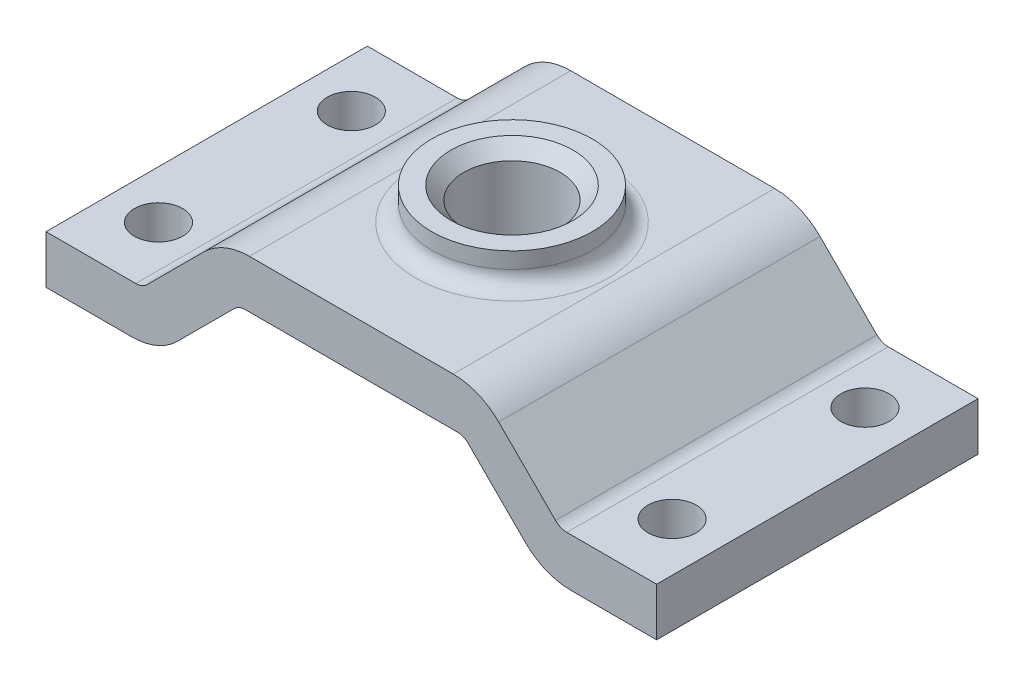
ISO-10303-21;
HEADER;
FILE_DESCRIPTION(('STEP AP214'),'2;1');
FILE_NAME('part.step','',(''),(''),'','','');
FILE_SCHEMA(('AUTOMOTIVE_DESIGN { 1 0 10303 214 1 1 1 1 }'));
ENDSEC;
DATA;
#1=APPLICATION_CONTEXT('core data for automotive mechanical design processes');
#2=APPLICATION_PROTOCOL_DEFINITION('international standard','automotive_design',2000,#1);
#3=PRODUCT_CONTEXT('',#1,'mechanical');
#4=PRODUCT('Part','Part','',(#3));
#5=PRODUCT_RELATED_PRODUCT_CATEGORY('part','',(#4));
#6=PRODUCT_DEFINITION_FORMATION('','',#4);
#7=PRODUCT_DEFINITION_CONTEXT('part definition',#1,'design');
#8=PRODUCT_DEFINITION('design','',#6,#7);
#9=PRODUCT_DEFINITION_SHAPE('','',#8);
#10=(LENGTH_UNIT() NAMED_UNIT(*) SI_UNIT(.MILLI.,.METRE.));
#11=(NAMED_UNIT(*) PLANE_ANGLE_UNIT() SI_UNIT($,.RADIAN.));
#12=(NAMED_UNIT(*) SI_UNIT($,.STERADIAN.) SOLID_ANGLE_UNIT());
#13=UNCERTAINTY_MEASURE_WITH_UNIT(LENGTH_MEASURE(1.E-05),#10,'distance_accuracy_value','');
#14=(GEOMETRIC_REPRESENTATION_CONTEXT(3) GLOBAL_UNCERTAINTY_ASSIGNED_CONTEXT((#13)) GLOBAL_UNIT_ASSIGNED_CONTEXT((#10,
#11,#12)) REPRESENTATION_CONTEXT('',''));
#15=CARTESIAN_POINT('',(0.,0.,0.));
#16=DIRECTION('',(0.,0.,1.));
#17=DIRECTION('',(1.,0.,0.));
#18=AXIS2_PLACEMENT_3D('',#15,#16,#17);
#19=CARTESIAN_POINT('',(-12.7,12.7,31.75));
#20=DIRECTION('',(0.707106781186548,-0.707106781186547,0.));
#21=DIRECTION('',(0.707106781186547,0.707106781186548,0.));
#22=AXIS2_PLACEMENT_3D('',#19,#20,#21);
#23=PLANE('',#22);
#24=DIRECTION('',(-0.707106781186547,-0.707106781186548,0.));
#25=VECTOR('',#24,1.);
#26=CARTESIAN_POINT('',(-12.7,12.7,-31.75));
#27=LINE('',#26,#25);
#28=CARTESIAN_POINT('',(-29.1197438789309,-3.71974387893088,-31.75));
#29=VERTEX_POINT('',#28);
#30=CARTESIAN_POINT('',(-40.3450640302673,-14.9450640302673,-31.75));
#31=VERTEX_POINT('',#30);
#32=EDGE_CURVE('E222',#29,#31,#27,.T.);
#33=ORIENTED_EDGE('',*,*,#32,.T.);
#34=DIRECTION('',(0.,0.,-1.));
#35=VECTOR('',#34,1.);
#36=CARTESIAN_POINT('',(-40.3450640302673,-14.9450640302673,31.75));
#37=LINE('',#36,#35);
#38=CARTESIAN_POINT('',(-40.3450640302673,-14.9450640302673,31.75));
#39=VERTEX_POINT('',#38);
#40=EDGE_CURVE('E351',#39,#31,#37,.T.);
#41=ORIENTED_EDGE('',*,*,#40,.F.);
#42=DIRECTION('',(-0.707106781186547,-0.707106781186548,0.));
#43=VECTOR('',#42,1.);
#44=CARTESIAN_POINT('',(-12.7,12.7,31.75));
#45=LINE('',#44,#43);
#46=CARTESIAN_POINT('',(-29.1197438789309,-3.71974387893088,31.75));
#47=VERTEX_POINT('',#46);
#48=EDGE_CURVE('E294',#47,#39,#45,.T.);
#49=ORIENTED_EDGE('',*,*,#48,.F.);
#50=DIRECTION('',(0.,0.,-1.));
#51=VECTOR('',#50,1.);
#52=CARTESIAN_POINT('',(-29.1197438789309,-3.71974387893088,31.75));
#53=LINE('',#52,#51);
#54=EDGE_CURVE('E64',#47,#29,#53,.T.);
#55=ORIENTED_EDGE('',*,*,#54,.T.);
#56=EDGE_LOOP('',(#33,#41,#49,#55));
#57=FACE_BOUND('',#56,.T.);
#58=ADVANCED_FACE('F45',(#57),#23,.F.);
#59=CARTESIAN_POINT('',(-42.5901280605346,-12.7,31.75));
#60=DIRECTION('',(0.,0.,-1.));
#61=DIRECTION('',(-1.,0.,0.));
#62=AXIS2_PLACEMENT_3D('',#59,#60,#61);
#63=CYLINDRICAL_SURFACE('',#62,3.175);
#64=CARTESIAN_POINT('',(-42.5901280605346,-12.7,-31.75));
#65=DIRECTION('',(0.,0.,1.));
#66=DIRECTION('',(1.,0.,0.));
#67=AXIS2_PLACEMENT_3D('',#64,#65,#66);
#68=CIRCLE('',#67,3.175);
#69=CARTESIAN_POINT('',(-42.5901280605346,-15.875,-31.75));
#70=VERTEX_POINT('',#69);
#71=EDGE_CURVE('E225',#31,#70,#68,.F.);
#72=ORIENTED_EDGE('',*,*,#71,.T.);
#73=DIRECTION('',(0.,0.,-1.));
#74=VECTOR('',#73,1.);
#75=CARTESIAN_POINT('',(-42.5901280605346,-15.875,31.75));
#76=LINE('',#75,#74);
#77=CARTESIAN_POINT('',(-42.5901280605346,-15.875,31.75));
#78=VERTEX_POINT('',#77);
#79=EDGE_CURVE('E347',#78,#70,#76,.T.);
#80=ORIENTED_EDGE('',*,*,#79,.F.);
#81=CARTESIAN_POINT('',(-42.5901280605346,-12.7,31.75));
#82=DIRECTION('',(0.,0.,1.));
#83=DIRECTION('',(1.,0.,0.));
#84=AXIS2_PLACEMENT_3D('',#81,#82,#83);
#85=CIRCLE('',#84,3.175);
#86=EDGE_CURVE('E139',#39,#78,#85,.F.);
#87=ORIENTED_EDGE('',*,*,#86,.F.);
#88=ORIENTED_EDGE('',*,*,#40,.T.);
#89=EDGE_LOOP('',(#72,#80,#87,#88));
#90=FACE_BOUND('',#89,.T.);
#91=ADVANCED_FACE('F391',(#90),#63,.F.);
#92=CARTESIAN_POINT('',(0.,-15.875,31.75));
#93=DIRECTION('',(0.,-1.,0.));
#94=DIRECTION('',(1.,0.,0.));
#95=AXIS2_PLACEMENT_3D('',#92,#93,#94);
#96=PLANE('',#95);
#97=CARTESIAN_POINT('',(-50.8,-15.875,19.05));
#98=DIRECTION('',(0.,1.,0.));
#99=DIRECTION('',(-1.,0.,0.));
#100=AXIS2_PLACEMENT_3D('',#97,#98,#99);
#101=CIRCLE('',#100,4.7625);
#102=CARTESIAN_POINT('',(-55.5625,-15.875,19.05));
#103=VERTEX_POINT('',#102);
#104=EDGE_CURVE('E562',#103,#103,#101,.T.);
#105=ORIENTED_EDGE('',*,*,#104,.F.);
#106=EDGE_LOOP('',(#105));
#107=FACE_BOUND('',#106,.T.);
#108=CARTESIAN_POINT('',(-50.8,-15.875,-19.05));
#109=DIRECTION('',(0.,1.,0.));
#110=DIRECTION('',(-1.,0.,0.));
#111=AXIS2_PLACEMENT_3D('',#108,#109,#110);
#112=CIRCLE('',#111,4.7625);
#113=CARTESIAN_POINT('',(-55.5625,-15.875,-19.05));
#114=VERTEX_POINT('',#113);
#115=EDGE_CURVE('E566',#114,#114,#112,.T.);
#116=ORIENTED_EDGE('',*,*,#115,.F.);
#117=EDGE_LOOP('',(#116));
#118=FACE_BOUND('',#117,.T.);
#119=DIRECTION('',(-1.,0.,0.));
#120=VECTOR('',#119,1.);
#121=CARTESIAN_POINT('',(0.,-15.875,-31.75));
#122=LINE('',#121,#120);
#123=CARTESIAN_POINT('',(-60.325,-15.875,-31.75));
#124=VERTEX_POINT('',#123);
#125=EDGE_CURVE('E229',#70,#124,#122,.T.);
#126=ORIENTED_EDGE('',*,*,#125,.T.);
#127=DIRECTION('',(0.,0.,-1.));
#128=VECTOR('',#127,1.);
#129=CARTESIAN_POINT('',(-60.325,-15.875,31.75));
#130=LINE('',#129,#128);
#131=CARTESIAN_POINT('',(-60.325,-15.875,31.75));
#132=VERTEX_POINT('',#131);
#133=EDGE_CURVE('E343',#132,#124,#130,.T.);
#134=ORIENTED_EDGE('',*,*,#133,.F.);
#135=DIRECTION('',(-1.,0.,0.));
#136=VECTOR('',#135,1.);
#137=CARTESIAN_POINT('',(0.,-15.875,31.75));
#138=LINE('',#137,#136);
#139=EDGE_CURVE('E432',#78,#132,#138,.T.);
#140=ORIENTED_EDGE('',*,*,#139,.F.);
#141=ORIENTED_EDGE('',*,*,#79,.T.);
#142=EDGE_LOOP('',(#126,#134,#140,#141));
#143=FACE_BOUND('',#142,.T.);
#144=ADVANCED_FACE('F396',(#107,#118,#143),#96,.F.);
#145=CARTESIAN_POINT('',(-60.325,0.,31.75));
#146=DIRECTION('',(1.,0.,0.));
#147=DIRECTION('',(0.,0.,-1.));
#148=AXIS2_PLACEMENT_3D('',#145,#146,#147);
#149=PLANE('',#148);
#150=DIRECTION('',(0.,-1.,0.));
#151=VECTOR('',#150,1.);
#152=CARTESIAN_POINT('',(-60.325,0.,-31.75));
#153=LINE('',#152,#151);
#154=CARTESIAN_POINT('',(-60.325,-25.4,-31.75));
#155=VERTEX_POINT('',#154);
#156=EDGE_CURVE('E232',#124,#155,#153,.T.);
#157=ORIENTED_EDGE('',*,*,#156,.T.);
#158=DIRECTION('',(0.,0.,-1.));
#159=VECTOR('',#158,1.);
#160=CARTESIAN_POINT('',(-60.325,-25.4,31.75));
#161=LINE('',#160,#159);
#162=CARTESIAN_POINT('',(-60.325,-25.4,31.75));
#163=VERTEX_POINT('',#162);
#164=EDGE_CURVE('E339',#163,#155,#161,.T.);
#165=ORIENTED_EDGE('',*,*,#164,.F.);
#166=DIRECTION('',(0.,-1.,0.));
#167=VECTOR('',#166,1.);
#168=CARTESIAN_POINT('',(-60.325,0.,31.75));
#169=LINE('',#168,#167);
#170=EDGE_CURVE('E435',#132,#163,#169,.T.);
#171=ORIENTED_EDGE('',*,*,#170,.F.);
#172=ORIENTED_EDGE('',*,*,#133,.T.);
#173=EDGE_LOOP('',(#157,#165,#171,#172));
#174=FACE_BOUND('',#173,.T.);
#175=ADVANCED_FACE('F551',(#174),#149,.F.);
#176=CARTESIAN_POINT('',(0.,-25.4,31.75));
#177=DIRECTION('',(0.,1.,0.));
#178=DIRECTION('',(0.,0.,1.));
#179=AXIS2_PLACEMENT_3D('',#176,#177,#178);
#180=PLANE('',#179);
#181=CARTESIAN_POINT('',(-50.8,-25.4,19.05));
#182=DIRECTION('',(0.,1.,0.));
#183=DIRECTION('',(-1.,0.,0.));
#184=AXIS2_PLACEMENT_3D('',#181,#182,#183);
#185=CIRCLE('',#184,4.7625);
#186=CARTESIAN_POINT('',(-55.5625,-25.4,19.05));
#187=VERTEX_POINT('',#186);
#188=EDGE_CURVE('E612',#187,#187,#185,.T.);
#189=ORIENTED_EDGE('',*,*,#188,.T.);
#190=EDGE_LOOP('',(#189));
#191=FACE_BOUND('',#190,.T.);
#192=CARTESIAN_POINT('',(-50.8,-25.4,-19.05));
#193=DIRECTION('',(0.,1.,0.));
#194=DIRECTION('',(-1.,0.,0.));
#195=AXIS2_PLACEMENT_3D('',#192,#193,#194);
#196=CIRCLE('',#195,4.7625);
#197=CARTESIAN_POINT('',(-55.5625,-25.4,-19.05));
#198=VERTEX_POINT('',#197);
#199=EDGE_CURVE('E606',#198,#198,#196,.T.);
#200=ORIENTED_EDGE('',*,*,#199,.T.);
#201=EDGE_LOOP('',(#200));
#202=FACE_BOUND('',#201,.T.);
#203=DIRECTION('',(1.,0.,0.));
#204=VECTOR('',#203,1.);
#205=CARTESIAN_POINT('',(0.,-25.4,-31.75));
#206=LINE('',#205,#204);
#207=CARTESIAN_POINT('',(-43.3605122421384,-25.4,-31.75));
#208=VERTEX_POINT('',#207);
#209=EDGE_CURVE('E235',#155,#208,#206,.T.);
#210=ORIENTED_EDGE('',*,*,#209,.T.);
#211=DIRECTION('',(0.,0.,-1.));
#212=VECTOR('',#211,1.);
#213=CARTESIAN_POINT('',(-43.3605122421384,-25.4,31.75));
#214=LINE('',#213,#212);
#215=CARTESIAN_POINT('',(-43.3605122421384,-25.4,31.75));
#216=VERTEX_POINT('',#215);
#217=EDGE_CURVE('E335',#216,#208,#214,.T.);
#218=ORIENTED_EDGE('',*,*,#217,.F.);
#219=DIRECTION('',(1.,0.,0.));
#220=VECTOR('',#219,1.);
#221=CARTESIAN_POINT('',(0.,-25.4,31.75));
#222=LINE('',#221,#220);
#223=EDGE_CURVE('E438',#163,#216,#222,.T.);
#224=ORIENTED_EDGE('',*,*,#223,.F.);
#225=ORIENTED_EDGE('',*,*,#164,.T.);
#226=EDGE_LOOP('',(#210,#218,#224,#225));
#227=FACE_BOUND('',#226,.T.);
#228=ADVANCED_FACE('F547',(#191,#202,#227),#180,.F.);
#229=CARTESIAN_POINT('',(-43.3605122421383,-12.7,31.75));
#230=DIRECTION('',(0.,0.,-1.));
#231=DIRECTION('',(-1.,0.,0.));
#232=AXIS2_PLACEMENT_3D('',#229,#230,#231);
#233=CYLINDRICAL_SURFACE('',#232,12.7);
#234=CARTESIAN_POINT('',(-43.3605122421383,-12.7,-31.75));
#235=DIRECTION('',(0.,0.,1.));
#236=DIRECTION('',(1.,0.,0.));
#237=AXIS2_PLACEMENT_3D('',#234,#235,#236);
#238=CIRCLE('',#237,12.7);
#239=CARTESIAN_POINT('',(-34.3802561210691,-21.6802561210691,-31.75));
#240=VERTEX_POINT('',#239);
#241=EDGE_CURVE('E238',#208,#240,#238,.T.);
#242=ORIENTED_EDGE('',*,*,#241,.T.);
#243=DIRECTION('',(0.,0.,-1.));
#244=VECTOR('',#243,1.);
#245=CARTESIAN_POINT('',(-34.3802561210691,-21.6802561210691,31.75));
#246=LINE('',#245,#244);
#247=CARTESIAN_POINT('',(-34.3802561210691,-21.6802561210691,31.75));
#248=VERTEX_POINT('',#247);
#249=EDGE_CURVE('E331',#248,#240,#246,.T.);
#250=ORIENTED_EDGE('',*,*,#249,.F.);
#251=CARTESIAN_POINT('',(-43.3605122421383,-12.7,31.75));
#252=DIRECTION('',(0.,0.,1.));
#253=DIRECTION('',(1.,0.,0.));
#254=AXIS2_PLACEMENT_3D('',#251,#252,#253);
#255=CIRCLE('',#254,12.7);
#256=EDGE_CURVE('E441',#216,#248,#255,.T.);
#257=ORIENTED_EDGE('',*,*,#256,.F.);
#258=ORIENTED_EDGE('',*,*,#217,.T.);
#259=EDGE_LOOP('',(#242,#250,#257,#258));
#260=FACE_BOUND('',#259,.T.);
#261=ADVANCED_FACE('F543',(#260),#233,.T.);
#262=CARTESIAN_POINT('',(-6.34999999999998,6.34999999999999,31.75));
#263=DIRECTION('',(-0.707106781186547,0.707106781186548,0.));
#264=DIRECTION('',(-0.707106781186548,-0.707106781186547,0.));
#265=AXIS2_PLACEMENT_3D('',#262,#263,#264);
#266=PLANE('',#265);
#267=DIRECTION('',(0.707106781186548,0.707106781186547,0.));
#268=VECTOR('',#267,1.);
#269=CARTESIAN_POINT('',(-6.34999999999998,6.34999999999999,-31.75));
#270=LINE('',#269,#268);
#271=CARTESIAN_POINT('',(-23.1549359697327,-10.4549359697327,-31.75));
#272=VERTEX_POINT('',#271);
#273=EDGE_CURVE('E241',#240,#272,#270,.T.);
#274=ORIENTED_EDGE('',*,*,#273,.T.);
#275=DIRECTION('',(0.,0.,-1.));
#276=VECTOR('',#275,1.);
#277=CARTESIAN_POINT('',(-23.1549359697327,-10.4549359697327,31.75));
#278=LINE('',#277,#276);
#279=CARTESIAN_POINT('',(-23.1549359697327,-10.4549359697327,31.75));
#280=VERTEX_POINT('',#279);
#281=EDGE_CURVE('E328',#280,#272,#278,.T.);
#282=ORIENTED_EDGE('',*,*,#281,.F.);
#283=DIRECTION('',(0.707106781186548,0.707106781186547,0.));
#284=VECTOR('',#283,1.);
#285=CARTESIAN_POINT('',(-6.34999999999998,6.34999999999999,31.75));
#286=LINE('',#285,#284);
#287=EDGE_CURVE('E444',#248,#280,#286,.T.);
#288=ORIENTED_EDGE('',*,*,#287,.F.);
#289=ORIENTED_EDGE('',*,*,#249,.T.);
#290=EDGE_LOOP('',(#274,#282,#288,#289));
#291=FACE_BOUND('',#290,.T.);
#292=ADVANCED_FACE('F539',(#291),#266,.F.);
#293=CARTESIAN_POINT('',(-20.9098719394654,-12.7,31.75));
#294=DIRECTION('',(0.,0.,-1.));
#295=DIRECTION('',(-1.,0.,0.));
#296=AXIS2_PLACEMENT_3D('',#293,#294,#295);
#297=CYLINDRICAL_SURFACE('',#296,3.175);
#298=CARTESIAN_POINT('',(-20.9098719394654,-12.7,-31.75));
#299=DIRECTION('',(0.,0.,1.));
#300=DIRECTION('',(1.,0.,0.));
#301=AXIS2_PLACEMENT_3D('',#298,#299,#300);
#302=CIRCLE('',#301,3.175);
#303=CARTESIAN_POINT('',(-20.9098719394654,-9.52499999999999,-31.75));
#304=VERTEX_POINT('',#303);
#305=EDGE_CURVE('E245',#304,#272,#302,.T.);
#306=ORIENTED_EDGE('',*,*,#305,.F.);
#307=DIRECTION('',(0.,0.,-1.));
#308=VECTOR('',#307,1.);
#309=CARTESIAN_POINT('',(-20.9098719394654,-9.52499999999999,31.75));
#310=LINE('',#309,#308);
#311=CARTESIAN_POINT('',(-20.9098719394654,-9.52499999999999,31.75));
#312=VERTEX_POINT('',#311);
#313=EDGE_CURVE('E325',#312,#304,#310,.T.);
#314=ORIENTED_EDGE('',*,*,#313,.F.);
#315=CARTESIAN_POINT('',(-20.9098719394654,-12.7,31.75));
#316=DIRECTION('',(0.,0.,1.));
#317=DIRECTION('',(1.,0.,0.));
#318=AXIS2_PLACEMENT_3D('',#315,#316,#317);
#319=CIRCLE('',#318,3.175);
#320=EDGE_CURVE('E447',#312,#280,#319,.T.);
#321=ORIENTED_EDGE('',*,*,#320,.T.);
#322=ORIENTED_EDGE('',*,*,#281,.T.);
#323=EDGE_LOOP('',(#306,#314,#321,#322));
#324=FACE_BOUND('',#323,.T.);
#325=ADVANCED_FACE('F535',(#324),#297,.F.);
#326=CARTESIAN_POINT('',(0.,-9.52499999999999,31.75));
#327=DIRECTION('',(0.,-1.,0.));
#328=DIRECTION('',(0.,0.,-1.));
#329=AXIS2_PLACEMENT_3D('',#326,#327,#328);
#330=PLANE('',#329);
#331=CARTESIAN_POINT('',(0.,-9.52499999999999,0.));
#332=DIRECTION('',(0.,-1.,0.));
#333=DIRECTION('',(0.,0.,-1.));
#334=AXIS2_PLACEMENT_3D('',#331,#332,#333);
#335=CIRCLE('',#334,19.05);
#336=CARTESIAN_POINT('',(0.,-9.52499999999999,-19.05));
#337=VERTEX_POINT('',#336);
#338=EDGE_CURVE('E358',#337,#337,#335,.F.);
#339=ORIENTED_EDGE('',*,*,#338,.T.);
#340=EDGE_LOOP('',(#339));
#341=FACE_BOUND('',#340,.T.);
#342=DIRECTION('',(-1.,0.,0.));
#343=VECTOR('',#342,1.);
#344=CARTESIAN_POINT('',(0.,-9.52499999999999,-31.75));
#345=LINE('',#344,#343);
#346=CARTESIAN_POINT('',(20.9098719394654,-9.52499999999999,-31.75));
#347=VERTEX_POINT('',#346);
#348=EDGE_CURVE('E249',#347,#304,#345,.T.);
#349=ORIENTED_EDGE('',*,*,#348,.F.);
#350=DIRECTION('',(0.,0.,-1.));
#351=VECTOR('',#350,1.);
#352=CARTESIAN_POINT('',(20.9098719394654,-9.52499999999999,31.75));
#353=LINE('',#352,#351);
#354=CARTESIAN_POINT('',(20.9098719394654,-9.52499999999999,31.75));
#355=VERTEX_POINT('',#354);
#356=EDGE_CURVE('E322',#355,#347,#353,.T.);
#357=ORIENTED_EDGE('',*,*,#356,.F.);
#358=DIRECTION('',(-1.,0.,0.));
#359=VECTOR('',#358,1.);
#360=CARTESIAN_POINT('',(0.,-9.52499999999999,31.75));
#361=LINE('',#360,#359);
#362=EDGE_CURVE('E451',#355,#312,#361,.T.);
#363=ORIENTED_EDGE('',*,*,#362,.T.);
#364=ORIENTED_EDGE('',*,*,#313,.T.);
#365=EDGE_LOOP('',(#349,#357,#363,#364));
#366=FACE_BOUND('',#365,.T.);
#367=ADVANCED_FACE('F531',(#341,#366),#330,.T.);
#368=CARTESIAN_POINT('',(20.9098719394654,-12.7,31.75));
#369=DIRECTION('',(0.,0.,-1.));
#370=DIRECTION('',(-1.,0.,0.));
#371=AXIS2_PLACEMENT_3D('',#368,#369,#370);
#372=CYLINDRICAL_SURFACE('',#371,3.175);
#373=CARTESIAN_POINT('',(20.9098719394654,-12.7,-31.75));
#374=DIRECTION('',(0.,0.,1.));
#375=DIRECTION('',(1.,0.,0.));
#376=AXIS2_PLACEMENT_3D('',#373,#374,#375);
#377=CIRCLE('',#376,3.175);
#378=CARTESIAN_POINT('',(23.1549359697327,-10.4549359697327,-31.75));
#379=VERTEX_POINT('',#378);
#380=EDGE_CURVE('E253',#347,#379,#377,.F.);
#381=ORIENTED_EDGE('',*,*,#380,.T.);
#382=DIRECTION('',(0.,0.,-1.));
#383=VECTOR('',#382,1.);
#384=CARTESIAN_POINT('',(23.1549359697327,-10.4549359697327,31.75));
#385=LINE('',#384,#383);
#386=CARTESIAN_POINT('',(23.1549359697327,-10.4549359697327,31.75));
#387=VERTEX_POINT('',#386);
#388=EDGE_CURVE('E319',#387,#379,#385,.T.);
#389=ORIENTED_EDGE('',*,*,#388,.F.);
#390=CARTESIAN_POINT('',(20.9098719394654,-12.7,31.75));
#391=DIRECTION('',(0.,0.,1.));
#392=DIRECTION('',(1.,0.,0.));
#393=AXIS2_PLACEMENT_3D('',#390,#391,#392);
#394=CIRCLE('',#393,3.175);
#395=EDGE_CURVE('E455',#355,#387,#394,.F.);
#396=ORIENTED_EDGE('',*,*,#395,.F.);
#397=ORIENTED_EDGE('',*,*,#356,.T.);
#398=EDGE_LOOP('',(#381,#389,#396,#397));
#399=FACE_BOUND('',#398,.T.);
#400=ADVANCED_FACE('F527',(#399),#372,.F.);
#401=CARTESIAN_POINT('',(6.34999999999998,6.34999999999999,31.75));
#402=DIRECTION('',(-0.707106781186547,-0.707106781186548,0.));
#403=DIRECTION('',(0.707106781186548,-0.707106781186547,0.));
#404=AXIS2_PLACEMENT_3D('',#401,#402,#403);
#405=PLANE('',#404);
#406=DIRECTION('',(-0.707106781186548,0.707106781186547,0.));
#407=VECTOR('',#406,1.);
#408=CARTESIAN_POINT('',(6.34999999999998,6.34999999999999,-31.75));
#409=LINE('',#408,#407);
#410=CARTESIAN_POINT('',(34.3802561210691,-21.6802561210691,-31.75));
#411=VERTEX_POINT('',#410);
#412=EDGE_CURVE('E257',#411,#379,#409,.T.);
#413=ORIENTED_EDGE('',*,*,#412,.F.);
#414=DIRECTION('',(0.,0.,-1.));
#415=VECTOR('',#414,1.);
#416=CARTESIAN_POINT('',(34.3802561210691,-21.6802561210691,31.75));
#417=LINE('',#416,#415);
#418=CARTESIAN_POINT('',(34.3802561210691,-21.6802561210691,31.75));
#419=VERTEX_POINT('',#418);
#420=EDGE_CURVE('E316',#419,#411,#417,.T.);
#421=ORIENTED_EDGE('',*,*,#420,.F.);
#422=DIRECTION('',(-0.707106781186548,0.707106781186547,0.));
#423=VECTOR('',#422,1.);
#424=CARTESIAN_POINT('',(6.34999999999998,6.34999999999999,31.75));
#425=LINE('',#424,#423);
#426=EDGE_CURVE('E458',#419,#387,#425,.T.);
#427=ORIENTED_EDGE('',*,*,#426,.T.);
#428=ORIENTED_EDGE('',*,*,#388,.T.);
#429=EDGE_LOOP('',(#413,#421,#427,#428));
#430=FACE_BOUND('',#429,.T.);
#431=ADVANCED_FACE('F523',(#430),#405,.T.);
#432=CARTESIAN_POINT('',(43.3605122421383,-12.7,31.75));
#433=DIRECTION('',(0.,0.,-1.));
#434=DIRECTION('',(-1.,0.,0.));
#435=AXIS2_PLACEMENT_3D('',#432,#433,#434);
#436=CYLINDRICAL_SURFACE('',#435,12.7);
#437=CARTESIAN_POINT('',(43.3605122421383,-12.7,-31.75));
#438=DIRECTION('',(0.,0.,1.));
#439=DIRECTION('',(1.,0.,0.));
#440=AXIS2_PLACEMENT_3D('',#437,#438,#439);
#441=CIRCLE('',#440,12.7);
#442=CARTESIAN_POINT('',(43.3605122421384,-25.4,-31.75));
#443=VERTEX_POINT('',#442);
#444=EDGE_CURVE('E261',#443,#411,#441,.F.);
#445=ORIENTED_EDGE('',*,*,#444,.F.);
#446=DIRECTION('',(0.,0.,-1.));
#447=VECTOR('',#446,1.);
#448=CARTESIAN_POINT('',(43.3605122421384,-25.4,31.75));
#449=LINE('',#448,#447);
#450=CARTESIAN_POINT('',(43.3605122421384,-25.4,31.75));
#451=VERTEX_POINT('',#450);
#452=EDGE_CURVE('E313',#451,#443,#449,.T.);
#453=ORIENTED_EDGE('',*,*,#452,.F.);
#454=CARTESIAN_POINT('',(43.3605122421383,-12.7,31.75));
#455=DIRECTION('',(0.,0.,1.));
#456=DIRECTION('',(1.,0.,0.));
#457=AXIS2_PLACEMENT_3D('',#454,#455,#456);
#458=CIRCLE('',#457,12.7);
#459=EDGE_CURVE('E462',#451,#419,#458,.F.);
#460=ORIENTED_EDGE('',*,*,#459,.T.);
#461=ORIENTED_EDGE('',*,*,#420,.T.);
#462=EDGE_LOOP('',(#445,#453,#460,#461));
#463=FACE_BOUND('',#462,.T.);
#464=ADVANCED_FACE('F519',(#463),#436,.T.);
#465=CARTESIAN_POINT('',(0.,-25.4,31.75));
#466=DIRECTION('',(0.,-1.,0.));
#467=DIRECTION('',(0.,0.,-1.));
#468=AXIS2_PLACEMENT_3D('',#465,#466,#467);
#469=PLANE('',#468);
#470=CARTESIAN_POINT('',(50.6903902684166,-25.4,-19.05));
#471=DIRECTION('',(0.,1.,0.));
#472=DIRECTION('',(-1.,0.,0.));
#473=AXIS2_PLACEMENT_3D('',#470,#471,#472);
#474=CIRCLE('',#473,4.7625);
#475=CARTESIAN_POINT('',(45.9278902684166,-25.4,-19.05));
#476=VERTEX_POINT('',#475);
#477=EDGE_CURVE('E927',#476,#476,#474,.T.);
#478=ORIENTED_EDGE('',*,*,#477,.T.);
#479=EDGE_LOOP('',(#478));
#480=FACE_BOUND('',#479,.T.);
#481=CARTESIAN_POINT('',(50.6903902684166,-25.4,19.05));
#482=DIRECTION('',(0.,1.,0.));
#483=DIRECTION('',(-1.,0.,0.));
#484=AXIS2_PLACEMENT_3D('',#481,#482,#483);
#485=CIRCLE('',#484,4.7625);
#486=CARTESIAN_POINT('',(45.9278902684166,-25.4,19.05));
#487=VERTEX_POINT('',#486);
#488=EDGE_CURVE('E918',#487,#487,#485,.T.);
#489=ORIENTED_EDGE('',*,*,#488,.T.);
#490=EDGE_LOOP('',(#489));
#491=FACE_BOUND('',#490,.T.);
#492=DIRECTION('',(-1.,0.,0.));
#493=VECTOR('',#492,1.);
#494=CARTESIAN_POINT('',(0.,-25.4,-31.75));
#495=LINE('',#494,#493);
#496=CARTESIAN_POINT('',(60.325,-25.4,-31.75));
#497=VERTEX_POINT('',#496);
#498=EDGE_CURVE('E265',#497,#443,#495,.T.);
#499=ORIENTED_EDGE('',*,*,#498,.F.);
#500=DIRECTION('',(0.,0.,-1.));
#501=VECTOR('',#500,1.);
#502=CARTESIAN_POINT('',(60.325,-25.4,31.75));
#503=LINE('',#502,#501);
#504=CARTESIAN_POINT('',(60.325,-25.4,31.75));
#505=VERTEX_POINT('',#504);
#506=EDGE_CURVE('E310',#505,#497,#503,.T.);
#507=ORIENTED_EDGE('',*,*,#506,.F.);
#508=DIRECTION('',(-1.,0.,0.));
#509=VECTOR('',#508,1.);
#510=CARTESIAN_POINT('',(0.,-25.4,31.75));
#511=LINE('',#510,#509);
#512=EDGE_CURVE('E466',#505,#451,#511,.T.);
#513=ORIENTED_EDGE('',*,*,#512,.T.);
#514=ORIENTED_EDGE('',*,*,#452,.T.);
#515=EDGE_LOOP('',(#499,#507,#513,#514));
#516=FACE_BOUND('',#515,.T.);
#517=ADVANCED_FACE('F515',(#480,#491,#516),#469,.T.);
#518=CARTESIAN_POINT('',(60.325,0.,31.75));
#519=DIRECTION('',(1.,0.,0.));
#520=DIRECTION('',(0.,0.,-1.));
#521=AXIS2_PLACEMENT_3D('',#518,#519,#520);
#522=PLANE('',#521);
#523=DIRECTION('',(0.,-1.,0.));
#524=VECTOR('',#523,1.);
#525=CARTESIAN_POINT('',(60.325,0.,-31.75));
#526=LINE('',#525,#524);
#527=CARTESIAN_POINT('',(60.325,-15.875,-31.75));
#528=VERTEX_POINT('',#527);
#529=EDGE_CURVE('E269',#528,#497,#526,.T.);
#530=ORIENTED_EDGE('',*,*,#529,.F.);
#531=DIRECTION('',(0.,0.,-1.));
#532=VECTOR('',#531,1.);
#533=CARTESIAN_POINT('',(60.325,-15.875,31.75));
#534=LINE('',#533,#532);
#535=CARTESIAN_POINT('',(60.325,-15.875,31.75));
#536=VERTEX_POINT('',#535);
#537=EDGE_CURVE('E307',#536,#528,#534,.T.);
#538=ORIENTED_EDGE('',*,*,#537,.F.);
#539=DIRECTION('',(0.,-1.,0.));
#540=VECTOR('',#539,1.);
#541=CARTESIAN_POINT('',(60.325,0.,31.75));
#542=LINE('',#541,#540);
#543=EDGE_CURVE('E470',#536,#505,#542,.T.);
#544=ORIENTED_EDGE('',*,*,#543,.T.);
#545=ORIENTED_EDGE('',*,*,#506,.T.);
#546=EDGE_LOOP('',(#530,#538,#544,#545));
#547=FACE_BOUND('',#546,.T.);
#548=ADVANCED_FACE('F511',(#547),#522,.T.);
#549=CARTESIAN_POINT('',(0.,-15.875,31.75));
#550=DIRECTION('',(0.,1.,0.));
#551=DIRECTION('',(-1.,0.,0.));
#552=AXIS2_PLACEMENT_3D('',#549,#550,#551);
#553=PLANE('',#552);
#554=CARTESIAN_POINT('',(50.6903902684166,-15.875,-19.05));
#555=DIRECTION('',(0.,1.,0.));
#556=DIRECTION('',(-1.,0.,0.));
#557=AXIS2_PLACEMENT_3D('',#554,#555,#556);
#558=CIRCLE('',#557,4.7625);
#559=CARTESIAN_POINT('',(45.9278902684166,-15.875,-19.05));
#560=VERTEX_POINT('',#559);
#561=EDGE_CURVE('E924',#560,#560,#558,.T.);
#562=ORIENTED_EDGE('',*,*,#561,.F.);
#563=EDGE_LOOP('',(#562));
#564=FACE_BOUND('',#563,.T.);
#565=CARTESIAN_POINT('',(50.6903902684166,-15.875,19.05));
#566=DIRECTION('',(0.,1.,0.));
#567=DIRECTION('',(-1.,0.,0.));
#568=AXIS2_PLACEMENT_3D('',#565,#566,#567);
#569=CIRCLE('',#568,4.7625);
#570=CARTESIAN_POINT('',(45.9278902684166,-15.875,19.05));
#571=VERTEX_POINT('',#570);
#572=EDGE_CURVE('E914',#571,#571,#569,.T.);
#573=ORIENTED_EDGE('',*,*,#572,.F.);
#574=EDGE_LOOP('',(#573));
#575=FACE_BOUND('',#574,.T.);
#576=DIRECTION('',(1.,0.,0.));
#577=VECTOR('',#576,1.);
#578=CARTESIAN_POINT('',(0.,-15.875,-31.75));
#579=LINE('',#578,#577);
#580=CARTESIAN_POINT('',(42.5901280605346,-15.875,-31.75));
#581=VERTEX_POINT('',#580);
#582=EDGE_CURVE('E273',#581,#528,#579,.T.);
#583=ORIENTED_EDGE('',*,*,#582,.F.);
#584=DIRECTION('',(0.,0.,-1.));
#585=VECTOR('',#584,1.);
#586=CARTESIAN_POINT('',(42.5901280605346,-15.875,31.75));
#587=LINE('',#586,#585);
#588=CARTESIAN_POINT('',(42.5901280605346,-15.875,31.75));
#589=VERTEX_POINT('',#588);
#590=EDGE_CURVE('E304',#589,#581,#587,.T.);
#591=ORIENTED_EDGE('',*,*,#590,.F.);
#592=DIRECTION('',(1.,0.,0.));
#593=VECTOR('',#592,1.);
#594=CARTESIAN_POINT('',(0.,-15.875,31.75));
#595=LINE('',#594,#593);
#596=EDGE_CURVE('E474',#589,#536,#595,.T.);
#597=ORIENTED_EDGE('',*,*,#596,.T.);
#598=ORIENTED_EDGE('',*,*,#537,.T.);
#599=EDGE_LOOP('',(#583,#591,#597,#598));
#600=FACE_BOUND('',#599,.T.);
#601=ADVANCED_FACE('F507',(#564,#575,#600),#553,.T.);
#602=CARTESIAN_POINT('',(42.5901280605346,-12.7,31.75));
#603=DIRECTION('',(0.,0.,-1.));
#604=DIRECTION('',(-1.,0.,0.));
#605=AXIS2_PLACEMENT_3D('',#602,#603,#604);
#606=CYLINDRICAL_SURFACE('',#605,3.175);
#607=CARTESIAN_POINT('',(42.5901280605346,-12.7,-31.75));
#608=DIRECTION('',(0.,0.,1.));
#609=DIRECTION('',(1.,0.,0.));
#610=AXIS2_PLACEMENT_3D('',#607,#608,#609);
#611=CIRCLE('',#610,3.175);
#612=CARTESIAN_POINT('',(40.3450640302673,-14.9450640302673,-31.75));
#613=VERTEX_POINT('',#612);
#614=EDGE_CURVE('E277',#613,#581,#611,.T.);
#615=ORIENTED_EDGE('',*,*,#614,.F.);
#616=DIRECTION('',(0.,0.,-1.));
#617=VECTOR('',#616,1.);
#618=CARTESIAN_POINT('',(40.3450640302673,-14.9450640302673,31.75));
#619=LINE('',#618,#617);
#620=CARTESIAN_POINT('',(40.3450640302673,-14.9450640302673,31.75));
#621=VERTEX_POINT('',#620);
#622=EDGE_CURVE('E301',#621,#613,#619,.T.);
#623=ORIENTED_EDGE('',*,*,#622,.F.);
#624=CARTESIAN_POINT('',(42.5901280605346,-12.7,31.75));
#625=DIRECTION('',(0.,0.,1.));
#626=DIRECTION('',(1.,0.,0.));
#627=AXIS2_PLACEMENT_3D('',#624,#625,#626);
#628=CIRCLE('',#627,3.175);
#629=EDGE_CURVE('E478',#621,#589,#628,.T.);
#630=ORIENTED_EDGE('',*,*,#629,.T.);
#631=ORIENTED_EDGE('',*,*,#590,.T.);
#632=EDGE_LOOP('',(#615,#623,#630,#631));
#633=FACE_BOUND('',#632,.T.);
#634=ADVANCED_FACE('F504',(#633),#606,.F.);
#635=CARTESIAN_POINT('',(12.7,12.7,31.75));
#636=DIRECTION('',(0.707106781186548,0.707106781186547,0.));
#637=DIRECTION('',(-0.707106781186547,0.707106781186548,0.));
#638=AXIS2_PLACEMENT_3D('',#635,#636,#637);
#639=PLANE('',#638);
#640=DIRECTION('',(0.707106781186547,-0.707106781186548,0.));
#641=VECTOR('',#640,1.);
#642=CARTESIAN_POINT('',(12.7,12.7,-31.75));
#643=LINE('',#642,#641);
#644=CARTESIAN_POINT('',(29.1197438789309,-3.71974387893088,-31.75));
#645=VERTEX_POINT('',#644);
#646=EDGE_CURVE('E281',#645,#613,#643,.T.);
#647=ORIENTED_EDGE('',*,*,#646,.F.);
#648=DIRECTION('',(0.,0.,-1.));
#649=VECTOR('',#648,1.);
#650=CARTESIAN_POINT('',(29.1197438789309,-3.71974387893088,31.75));
#651=LINE('',#650,#649);
#652=CARTESIAN_POINT('',(29.1197438789309,-3.71974387893088,31.75));
#653=VERTEX_POINT('',#652);
#654=EDGE_CURVE('E212',#653,#645,#651,.T.);
#655=ORIENTED_EDGE('',*,*,#654,.F.);
#656=DIRECTION('',(0.707106781186547,-0.707106781186548,0.));
#657=VECTOR('',#656,1.);
#658=CARTESIAN_POINT('',(12.7,12.7,31.75));
#659=LINE('',#658,#657);
#660=EDGE_CURVE('E200',#653,#621,#659,.T.);
#661=ORIENTED_EDGE('',*,*,#660,.T.);
#662=ORIENTED_EDGE('',*,*,#622,.T.);
#663=EDGE_LOOP('',(#647,#655,#661,#662));
#664=FACE_BOUND('',#663,.T.);
#665=ADVANCED_FACE('F484',(#664),#639,.T.);
#666=CARTESIAN_POINT('',(20.1394877578617,-12.7,31.75));
#667=DIRECTION('',(0.,0.,-1.));
#668=DIRECTION('',(-1.,0.,0.));
#669=AXIS2_PLACEMENT_3D('',#666,#667,#668);
#670=CYLINDRICAL_SURFACE('',#669,12.7);
#671=CARTESIAN_POINT('',(20.1394877578617,-12.7,-31.75));
#672=DIRECTION('',(0.,0.,1.));
#673=DIRECTION('',(1.,0.,0.));
#674=AXIS2_PLACEMENT_3D('',#671,#672,#673);
#675=CIRCLE('',#674,12.7);
#676=CARTESIAN_POINT('',(20.1394877578616,0.,-31.75));
#677=VERTEX_POINT('',#676);
#678=EDGE_CURVE('E208',#645,#677,#675,.T.);
#679=ORIENTED_EDGE('',*,*,#678,.T.);
#680=DIRECTION('',(0.,0.,-1.));
#681=VECTOR('',#680,1.);
#682=CARTESIAN_POINT('',(20.1394877578616,0.,31.75));
#683=LINE('',#682,#681);
#684=CARTESIAN_POINT('',(20.1394877578616,0.,31.75));
#685=VERTEX_POINT('',#684);
#686=EDGE_CURVE('E205',#685,#677,#683,.T.);
#687=ORIENTED_EDGE('',*,*,#686,.F.);
#688=CARTESIAN_POINT('',(20.1394877578617,-12.7,31.75));
#689=DIRECTION('',(0.,0.,1.));
#690=DIRECTION('',(1.,0.,0.));
#691=AXIS2_PLACEMENT_3D('',#688,#689,#690);
#692=CIRCLE('',#691,12.7);
#693=EDGE_CURVE('E192',#653,#685,#692,.T.);
#694=ORIENTED_EDGE('',*,*,#693,.F.);
#695=ORIENTED_EDGE('',*,*,#654,.T.);
#696=EDGE_LOOP('',(#679,#687,#694,#695));
#697=FACE_BOUND('',#696,.T.);
#698=ADVANCED_FACE('F206',(#697),#670,.T.);
#699=CARTESIAN_POINT('',(0.,0.,31.75));
#700=DIRECTION('',(0.,1.,0.));
#701=DIRECTION('',(0.,0.,1.));
#702=AXIS2_PLACEMENT_3D('',#699,#700,#701);
#703=PLANE('',#702);
#704=CARTESIAN_POINT('',(0.,0.,0.));
#705=DIRECTION('',(0.,1.,0.));
#706=DIRECTION('',(0.,0.,1.));
#707=AXIS2_PLACEMENT_3D('',#704,#705,#706);
#708=CIRCLE('',#707,19.05);
#709=CARTESIAN_POINT('',(0.,0.,19.05));
#710=VERTEX_POINT('',#709);
#711=EDGE_CURVE('E366',#710,#710,#708,.F.);
#712=ORIENTED_EDGE('',*,*,#711,.T.);
#713=EDGE_LOOP('',(#712));
#714=FACE_BOUND('',#713,.T.);
#715=DIRECTION('',(1.,0.,0.));
#716=VECTOR('',#715,1.);
#717=CARTESIAN_POINT('',(0.,0.,-31.75));
#718=LINE('',#717,#716);
#719=CARTESIAN_POINT('',(-20.1394877578616,0.,-31.75));
#720=VERTEX_POINT('',#719);
#721=EDGE_CURVE('E287',#720,#677,#718,.T.);
#722=ORIENTED_EDGE('',*,*,#721,.F.);
#723=DIRECTION('',(0.,0.,-1.));
#724=VECTOR('',#723,1.);
#725=CARTESIAN_POINT('',(-20.1394877578616,0.,31.75));
#726=LINE('',#725,#724);
#727=CARTESIAN_POINT('',(-20.1394877578616,0.,31.75));
#728=VERTEX_POINT('',#727);
#729=EDGE_CURVE('E126',#728,#720,#726,.T.);
#730=ORIENTED_EDGE('',*,*,#729,.F.);
#731=DIRECTION('',(1.,0.,0.));
#732=VECTOR('',#731,1.);
#733=CARTESIAN_POINT('',(0.,0.,31.75));
#734=LINE('',#733,#732);
#735=EDGE_CURVE('E197',#728,#685,#734,.T.);
#736=ORIENTED_EDGE('',*,*,#735,.T.);
#737=ORIENTED_EDGE('',*,*,#686,.T.);
#738=EDGE_LOOP('',(#722,#730,#736,#737));
#739=FACE_BOUND('',#738,.T.);
#740=ADVANCED_FACE('F214',(#714,#739),#703,.T.);
#741=CARTESIAN_POINT('',(-20.1394877578617,-12.7,31.75));
#742=DIRECTION('',(0.,0.,-1.));
#743=DIRECTION('',(-1.,0.,0.));
#744=AXIS2_PLACEMENT_3D('',#741,#742,#743);
#745=CYLINDRICAL_SURFACE('',#744,12.7);
#746=CARTESIAN_POINT('',(-20.1394877578617,-12.7,-31.75));
#747=DIRECTION('',(0.,0.,1.));
#748=DIRECTION('',(1.,0.,0.));
#749=AXIS2_PLACEMENT_3D('',#746,#747,#748);
#750=CIRCLE('',#749,12.7);
#751=EDGE_CURVE('E290',#29,#720,#750,.F.);
#752=ORIENTED_EDGE('',*,*,#751,.F.);
#753=ORIENTED_EDGE('',*,*,#54,.F.);
#754=CARTESIAN_POINT('',(-20.1394877578617,-12.7,31.75));
#755=DIRECTION('',(0.,0.,1.));
#756=DIRECTION('',(1.,0.,0.));
#757=AXIS2_PLACEMENT_3D('',#754,#755,#756);
#758=CIRCLE('',#757,12.7);
#759=EDGE_CURVE('E216',#47,#728,#758,.F.);
#760=ORIENTED_EDGE('',*,*,#759,.T.);
#761=ORIENTED_EDGE('',*,*,#729,.T.);
#762=EDGE_LOOP('',(#752,#753,#760,#761));
#763=FACE_BOUND('',#762,.T.);
#764=ADVANCED_FACE('F488',(#763),#745,.T.);
#765=CARTESIAN_POINT('',(0.,0.,31.75));
#766=DIRECTION('',(0.,0.,1.));
#767=DIRECTION('',(1.,0.,0.));
#768=AXIS2_PLACEMENT_3D('',#765,#766,#767);
#769=PLANE('',#768);
#770=ORIENTED_EDGE('',*,*,#48,.T.);
#771=ORIENTED_EDGE('',*,*,#86,.T.);
#772=ORIENTED_EDGE('',*,*,#139,.T.);
#773=ORIENTED_EDGE('',*,*,#170,.T.);
#774=ORIENTED_EDGE('',*,*,#223,.T.);
#775=ORIENTED_EDGE('',*,*,#256,.T.);
#776=ORIENTED_EDGE('',*,*,#287,.T.);
#777=ORIENTED_EDGE('',*,*,#320,.F.);
#778=ORIENTED_EDGE('',*,*,#362,.F.);
#779=ORIENTED_EDGE('',*,*,#395,.T.);
#780=ORIENTED_EDGE('',*,*,#426,.F.);
#781=ORIENTED_EDGE('',*,*,#459,.F.);
#782=ORIENTED_EDGE('',*,*,#512,.F.);
#783=ORIENTED_EDGE('',*,*,#543,.F.);
#784=ORIENTED_EDGE('',*,*,#596,.F.);
#785=ORIENTED_EDGE('',*,*,#629,.F.);
#786=ORIENTED_EDGE('',*,*,#660,.F.);
#787=ORIENTED_EDGE('',*,*,#693,.T.);
#788=ORIENTED_EDGE('',*,*,#735,.F.);
#789=ORIENTED_EDGE('',*,*,#759,.F.);
#790=EDGE_LOOP('',(#770,#771,#772,#773,#774,#775,#776,#777,#778,#779,#780,#781,#782,#783,#784,
#785,#786,#787,#788,#789));
#791=FACE_BOUND('',#790,.T.);
#792=ADVANCED_FACE('F194',(#791),#769,.T.);
#793=CARTESIAN_POINT('',(0.,0.,-31.75));
#794=DIRECTION('',(0.,0.,1.));
#795=DIRECTION('',(1.,0.,0.));
#796=AXIS2_PLACEMENT_3D('',#793,#794,#795);
#797=PLANE('',#796);
#798=ORIENTED_EDGE('',*,*,#32,.F.);
#799=ORIENTED_EDGE('',*,*,#751,.T.);
#800=ORIENTED_EDGE('',*,*,#721,.T.);
#801=ORIENTED_EDGE('',*,*,#678,.F.);
#802=ORIENTED_EDGE('',*,*,#646,.T.);
#803=ORIENTED_EDGE('',*,*,#614,.T.);
#804=ORIENTED_EDGE('',*,*,#582,.T.);
#805=ORIENTED_EDGE('',*,*,#529,.T.);
#806=ORIENTED_EDGE('',*,*,#498,.T.);
#807=ORIENTED_EDGE('',*,*,#444,.T.);
#808=ORIENTED_EDGE('',*,*,#412,.T.);
#809=ORIENTED_EDGE('',*,*,#380,.F.);
#810=ORIENTED_EDGE('',*,*,#348,.T.);
#811=ORIENTED_EDGE('',*,*,#305,.T.);
#812=ORIENTED_EDGE('',*,*,#273,.F.);
#813=ORIENTED_EDGE('',*,*,#241,.F.);
#814=ORIENTED_EDGE('',*,*,#209,.F.);
#815=ORIENTED_EDGE('',*,*,#156,.F.);
#816=ORIENTED_EDGE('',*,*,#125,.F.);
#817=ORIENTED_EDGE('',*,*,#71,.F.);
#818=EDGE_LOOP('',(#798,#799,#800,#801,#802,#803,#804,#805,#806,#807,#808,#809,#810,#811,#812,
#813,#814,#815,#816,#817));
#819=FACE_BOUND('',#818,.T.);
#820=ADVANCED_FACE('F487',(#819),#797,.F.);
#821=CARTESIAN_POINT('',(0.,6.35,0.));
#822=DIRECTION('',(0.,1.,0.));
#823=DIRECTION('',(0.,0.,1.));
#824=AXIS2_PLACEMENT_3D('',#821,#822,#823);
#825=PLANE('',#824);
#826=CARTESIAN_POINT('',(0.,6.35,0.));
#827=DIRECTION('',(0.,1.,0.));
#828=DIRECTION('',(0.,0.,1.));
#829=AXIS2_PLACEMENT_3D('',#826,#827,#828);
#830=CIRCLE('',#829,12.065);
#831=CARTESIAN_POINT('',(0.,6.35,12.065));
#832=VERTEX_POINT('',#831);
#833=EDGE_CURVE('E11',#832,#832,#830,.F.);
#834=ORIENTED_EDGE('',*,*,#833,.T.);
#835=EDGE_LOOP('',(#834));
#836=FACE_BOUND('',#835,.T.);
#837=CARTESIAN_POINT('',(0.,6.35,0.));
#838=DIRECTION('',(0.,1.,0.));
#839=DIRECTION('',(0.,0.,1.));
#840=AXIS2_PLACEMENT_3D('',#837,#838,#839);
#841=CIRCLE('',#840,15.875);
#842=CARTESIAN_POINT('',(0.,6.35,15.875));
#843=VERTEX_POINT('',#842);
#844=EDGE_CURVE('E420',#843,#843,#841,.T.);
#845=ORIENTED_EDGE('',*,*,#844,.T.);
#846=EDGE_LOOP('',(#845));
#847=FACE_BOUND('',#846,.T.);
#848=ADVANCED_FACE('F624',(#836,#847),#825,.T.);
#849=CARTESIAN_POINT('',(0.,-25.4,0.));
#850=DIRECTION('',(0.,1.,0.));
#851=DIRECTION('',(0.,0.,1.));
#852=AXIS2_PLACEMENT_3D('',#849,#850,#851);
#853=CYLINDRICAL_SURFACE('',#852,15.875);
#854=CARTESIAN_POINT('',(0.,3.175,0.));
#855=DIRECTION('',(0.,1.,0.));
#856=DIRECTION('',(0.,0.,1.));
#857=AXIS2_PLACEMENT_3D('',#854,#855,#856);
#858=CIRCLE('',#857,15.875);
#859=CARTESIAN_POINT('',(0.,3.175,15.875));
#860=VERTEX_POINT('',#859);
#861=EDGE_CURVE('E362',#860,#860,#858,.T.);
#862=ORIENTED_EDGE('',*,*,#861,.T.);
#863=EDGE_LOOP('',(#862));
#864=FACE_BOUND('',#863,.T.);
#865=ORIENTED_EDGE('',*,*,#844,.F.);
#866=EDGE_LOOP('',(#865));
#867=FACE_BOUND('',#866,.T.);
#868=ADVANCED_FACE('F414',(#864,#867),#853,.T.);
#869=CARTESIAN_POINT('',(0.,-12.7,0.));
#870=DIRECTION('',(0.,-1.,0.));
#871=DIRECTION('',(0.,0.,-1.));
#872=AXIS2_PLACEMENT_3D('',#869,#870,#871);
#873=CIRCLE('',#872,15.875);
#874=CARTESIAN_POINT('',(0.,-12.7,-15.875));
#875=VERTEX_POINT('',#874);
#876=EDGE_CURVE('E354',#875,#875,#873,.T.);
#877=ORIENTED_EDGE('',*,*,#876,.T.);
#878=EDGE_LOOP('',(#877));
#879=FACE_BOUND('',#878,.T.);
#880=CARTESIAN_POINT('',(0.,-25.4,0.));
#881=DIRECTION('',(0.,1.,0.));
#882=DIRECTION('',(0.,0.,1.));
#883=AXIS2_PLACEMENT_3D('',#880,#881,#882);
#884=CIRCLE('',#883,15.875);
#885=CARTESIAN_POINT('',(0.,-25.4,15.875));
#886=VERTEX_POINT('',#885);
#887=EDGE_CURVE('E226',#886,#886,#884,.T.);
#888=ORIENTED_EDGE('',*,*,#887,.T.);
#889=EDGE_LOOP('',(#888));
#890=FACE_BOUND('',#889,.T.);
#891=ADVANCED_FACE('F411',(#879,#890),#853,.T.);
#892=CARTESIAN_POINT('',(0.,-25.4,0.));
#893=DIRECTION('',(0.,1.,0.));
#894=DIRECTION('',(0.,0.,1.));
#895=AXIS2_PLACEMENT_3D('',#892,#893,#894);
#896=PLANE('',#895);
#897=CARTESIAN_POINT('',(0.,-25.4,0.));
#898=DIRECTION('',(0.,1.,0.));
#899=DIRECTION('',(0.,0.,1.));
#900=AXIS2_PLACEMENT_3D('',#897,#898,#899);
#901=CIRCLE('',#900,9.525);
#902=CARTESIAN_POINT('',(0.,-25.4,9.525));
#903=VERTEX_POINT('',#902);
#904=EDGE_CURVE('E424',#903,#903,#901,.T.);
#905=ORIENTED_EDGE('',*,*,#904,.T.);
#906=EDGE_LOOP('',(#905));
#907=FACE_BOUND('',#906,.T.);
#908=ORIENTED_EDGE('',*,*,#887,.F.);
#909=EDGE_LOOP('',(#908));
#910=FACE_BOUND('',#909,.T.);
#911=ADVANCED_FACE('F405',(#907,#910),#896,.F.);
#912=CARTESIAN_POINT('',(0.,-25.4,0.));
#913=DIRECTION('',(0.,1.,0.));
#914=DIRECTION('',(0.,0.,1.));
#915=AXIS2_PLACEMENT_3D('',#912,#913,#914);
#916=CYLINDRICAL_SURFACE('',#915,9.525);
#917=CARTESIAN_POINT('',(0.,3.81,0.));
#918=DIRECTION('',(0.,1.,0.));
#919=DIRECTION('',(0.,0.,1.));
#920=AXIS2_PLACEMENT_3D('',#917,#918,#919);
#921=CIRCLE('',#920,9.525);
#922=CARTESIAN_POINT('',(0.,3.81,9.525));
#923=VERTEX_POINT('',#922);
#924=EDGE_CURVE('E56',#923,#923,#921,.T.);
#925=ORIENTED_EDGE('',*,*,#924,.T.);
#926=EDGE_LOOP('',(#925));
#927=FACE_BOUND('',#926,.T.);
#928=ORIENTED_EDGE('',*,*,#904,.F.);
#929=EDGE_LOOP('',(#928));
#930=FACE_BOUND('',#929,.T.);
#931=ADVANCED_FACE('F373',(#927,#930),#916,.F.);
#932=CARTESIAN_POINT('',(0.,-12.7,0.));
#933=DIRECTION('',(0.,-1.,0.));
#934=DIRECTION('',(0.,0.,-1.));
#935=AXIS2_PLACEMENT_3D('',#932,#933,#934);
#936=TOROIDAL_SURFACE('',#935,19.05,3.175);
#937=ORIENTED_EDGE('',*,*,#338,.F.);
#938=EDGE_LOOP('',(#937));
#939=FACE_BOUND('',#938,.T.);
#940=ORIENTED_EDGE('',*,*,#876,.F.);
#941=EDGE_LOOP('',(#940));
#942=FACE_BOUND('',#941,.T.);
#943=ADVANCED_FACE('F387',(#939,#942),#936,.F.);
#944=CARTESIAN_POINT('',(0.,3.175,0.));
#945=DIRECTION('',(0.,1.,0.));
#946=DIRECTION('',(0.,0.,1.));
#947=AXIS2_PLACEMENT_3D('',#944,#945,#946);
#948=TOROIDAL_SURFACE('',#947,19.05,3.175);
#949=ORIENTED_EDGE('',*,*,#711,.F.);
#950=EDGE_LOOP('',(#949));
#951=FACE_BOUND('',#950,.T.);
#952=ORIENTED_EDGE('',*,*,#861,.F.);
#953=EDGE_LOOP('',(#952));
#954=FACE_BOUND('',#953,.T.);
#955=ADVANCED_FACE('F378',(#951,#954),#948,.F.);
#956=CARTESIAN_POINT('',(0.,3.81,0.));
#957=DIRECTION('',(0.,1.,0.));
#958=DIRECTION('',(0.,0.,1.));
#959=AXIS2_PLACEMENT_3D('',#956,#957,#958);
#960=CONICAL_SURFACE('',#959,9.525,0.785398163397449);
#961=ORIENTED_EDGE('',*,*,#833,.F.);
#962=EDGE_LOOP('',(#961));
#963=FACE_BOUND('',#962,.T.);
#964=ORIENTED_EDGE('',*,*,#924,.F.);
#965=EDGE_LOOP('',(#964));
#966=FACE_BOUND('',#965,.T.);
#967=ADVANCED_FACE('F48',(#963,#966),#960,.F.);
#968=CARTESIAN_POINT('',(50.6903902684166,-25.4,19.05));
#969=DIRECTION('',(0.,1.,0.));
#970=DIRECTION('',(-1.,0.,0.));
#971=AXIS2_PLACEMENT_3D('',#968,#969,#970);
#972=CYLINDRICAL_SURFACE('',#971,4.7625);
#973=ORIENTED_EDGE('',*,*,#488,.F.);
#974=EDGE_LOOP('',(#973));
#975=FACE_BOUND('',#974,.T.);
#976=ORIENTED_EDGE('',*,*,#572,.T.);
#977=EDGE_LOOP('',(#976));
#978=FACE_BOUND('',#977,.T.);
#979=ADVANCED_FACE('F377',(#975,#978),#972,.F.);
#980=CARTESIAN_POINT('',(50.6903902684166,-25.4,-19.05));
#981=DIRECTION('',(0.,1.,0.));
#982=DIRECTION('',(-1.,0.,0.));
#983=AXIS2_PLACEMENT_3D('',#980,#981,#982);
#984=CYLINDRICAL_SURFACE('',#983,4.7625);
#985=ORIENTED_EDGE('',*,*,#477,.F.);
#986=EDGE_LOOP('',(#985));
#987=FACE_BOUND('',#986,.T.);
#988=ORIENTED_EDGE('',*,*,#561,.T.);
#989=EDGE_LOOP('',(#988));
#990=FACE_BOUND('',#989,.T.);
#991=ADVANCED_FACE('F384',(#987,#990),#984,.F.);
#992=CARTESIAN_POINT('',(-50.8,-25.4,-19.05));
#993=DIRECTION('',(0.,1.,0.));
#994=DIRECTION('',(-1.,0.,0.));
#995=AXIS2_PLACEMENT_3D('',#992,#993,#994);
#996=CYLINDRICAL_SURFACE('',#995,4.7625);
#997=ORIENTED_EDGE('',*,*,#199,.F.);
#998=EDGE_LOOP('',(#997));
#999=FACE_BOUND('',#998,.T.);
#1000=ORIENTED_EDGE('',*,*,#115,.T.);
#1001=EDGE_LOOP('',(#1000));
#1002=FACE_BOUND('',#1001,.T.);
#1003=ADVANCED_FACE('F856',(#999,#1002),#996,.F.);
#1004=CARTESIAN_POINT('',(-50.8,-25.4,19.05));
#1005=DIRECTION('',(0.,1.,0.));
#1006=DIRECTION('',(-1.,0.,0.));
#1007=AXIS2_PLACEMENT_3D('',#1004,#1005,#1006);
#1008=CYLINDRICAL_SURFACE('',#1007,4.7625);
#1009=ORIENTED_EDGE('',*,*,#188,.F.);
#1010=EDGE_LOOP('',(#1009));
#1011=FACE_BOUND('',#1010,.T.);
#1012=ORIENTED_EDGE('',*,*,#104,.T.);
#1013=EDGE_LOOP('',(#1012));
#1014=FACE_BOUND('',#1013,.T.);
#1015=ADVANCED_FACE('F866',(#1011,#1014),#1008,.F.);
#1016=CLOSED_SHELL('',(#58,#91,#144,#175,#228,#261,#292,#325,#367,#400,#431,#464,#517,#548,#601,
#634,#665,#698,#740,#764,#792,#820,#848,#868,#891,#911,#931,#943,#955,#967,#979,#991,#1003,#1015));
#1017=MANIFOLD_SOLID_BREP('B2',#1016);
#1018=ADVANCED_BREP_SHAPE_REPRESENTATION('',(#18,#1017),#14);
#1019=SHAPE_DEFINITION_REPRESENTATION(#9,#1018);
ENDSEC;
END-ISO-10303-21;
